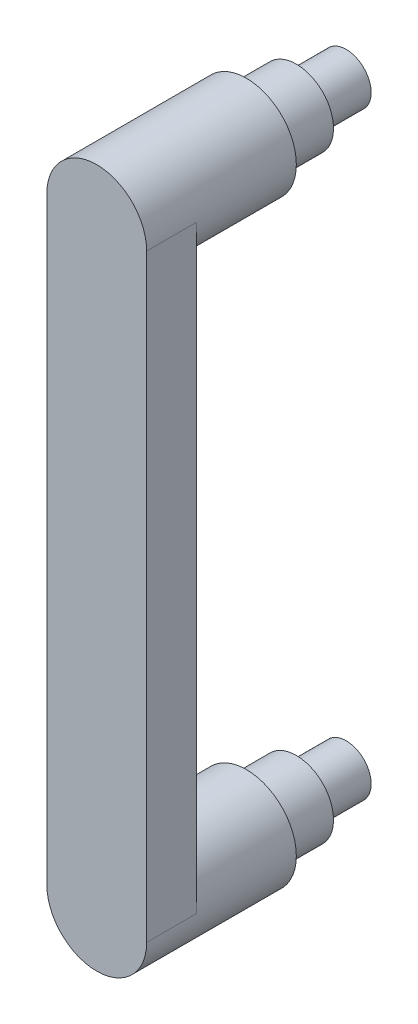
ISO-10303-21;
HEADER;
FILE_DESCRIPTION(('STEP AP214'),'2;1');
FILE_NAME('part.step','',(''),(''),'','','');
FILE_SCHEMA(('AUTOMOTIVE_DESIGN { 1 0 10303 214 1 1 1 1 }'));
ENDSEC;
DATA;
#1=APPLICATION_CONTEXT('core data for automotive mechanical design processes');
#2=APPLICATION_PROTOCOL_DEFINITION('international standard','automotive_design',2000,#1);
#3=PRODUCT_CONTEXT('',#1,'mechanical');
#4=PRODUCT('Part','Part','',(#3));
#5=PRODUCT_RELATED_PRODUCT_CATEGORY('part','',(#4));
#6=PRODUCT_DEFINITION_FORMATION('','',#4);
#7=PRODUCT_DEFINITION_CONTEXT('part definition',#1,'design');
#8=PRODUCT_DEFINITION('design','',#6,#7);
#9=PRODUCT_DEFINITION_SHAPE('','',#8);
#10=(LENGTH_UNIT() NAMED_UNIT(*) SI_UNIT(.MILLI.,.METRE.));
#11=(NAMED_UNIT(*) PLANE_ANGLE_UNIT() SI_UNIT($,.RADIAN.));
#12=(NAMED_UNIT(*) SI_UNIT($,.STERADIAN.) SOLID_ANGLE_UNIT());
#13=UNCERTAINTY_MEASURE_WITH_UNIT(LENGTH_MEASURE(1.E-05),#10,'distance_accuracy_value','');
#14=(GEOMETRIC_REPRESENTATION_CONTEXT(3) GLOBAL_UNCERTAINTY_ASSIGNED_CONTEXT((#13)) GLOBAL_UNIT_ASSIGNED_CONTEXT((#10,
#11,#12)) REPRESENTATION_CONTEXT('',''));
#15=CARTESIAN_POINT('',(0.,0.,0.));
#16=DIRECTION('',(0.,0.,1.));
#17=DIRECTION('',(1.,0.,0.));
#18=AXIS2_PLACEMENT_3D('',#15,#16,#17);
#19=CARTESIAN_POINT('',(0.,0.,4.));
#20=DIRECTION('',(0.,0.,-1.));
#21=DIRECTION('',(-1.,0.,0.));
#22=AXIS2_PLACEMENT_3D('',#19,#20,#21);
#23=CYLINDRICAL_SURFACE('',#22,1.49);
#24=CARTESIAN_POINT('',(0.,0.,4.));
#25=DIRECTION('',(0.,0.,1.));
#26=DIRECTION('',(1.,0.,0.));
#27=AXIS2_PLACEMENT_3D('',#24,#25,#26);
#28=CIRCLE('',#27,1.49);
#29=CARTESIAN_POINT('',(1.49,0.,4.));
#30=VERTEX_POINT('',#29);
#31=EDGE_CURVE('E152',#30,#30,#28,.T.);
#32=ORIENTED_EDGE('',*,*,#31,.F.);
#33=EDGE_LOOP('',(#32));
#34=FACE_BOUND('',#33,.T.);
#35=CARTESIAN_POINT('',(0.,0.,2.));
#36=DIRECTION('',(0.,0.,-1.));
#37=DIRECTION('',(-1.,0.,0.));
#38=AXIS2_PLACEMENT_3D('',#35,#36,#37);
#39=CIRCLE('',#38,1.49);
#40=CARTESIAN_POINT('',(-1.49,0.,2.));
#41=VERTEX_POINT('',#40);
#42=EDGE_CURVE('E116',#41,#41,#39,.T.);
#43=ORIENTED_EDGE('',*,*,#42,.F.);
#44=EDGE_LOOP('',(#43));
#45=FACE_BOUND('',#44,.T.);
#46=ADVANCED_FACE('F45',(#34,#45),#23,.T.);
#47=CARTESIAN_POINT('',(0.,24.,4.));
#48=DIRECTION('',(0.,0.,-1.));
#49=DIRECTION('',(-1.,0.,0.));
#50=AXIS2_PLACEMENT_3D('',#47,#48,#49);
#51=CYLINDRICAL_SURFACE('',#50,1.49);
#52=CARTESIAN_POINT('',(0.,24.,4.));
#53=DIRECTION('',(0.,0.,-1.));
#54=DIRECTION('',(1.,0.,0.));
#55=AXIS2_PLACEMENT_3D('',#52,#53,#54);
#56=CIRCLE('',#55,1.49);
#57=CARTESIAN_POINT('',(1.49,24.,4.));
#58=VERTEX_POINT('',#57);
#59=EDGE_CURVE('E127',#58,#58,#56,.T.);
#60=ORIENTED_EDGE('',*,*,#59,.T.);
#61=EDGE_LOOP('',(#60));
#62=FACE_BOUND('',#61,.T.);
#63=CARTESIAN_POINT('',(0.,24.,2.));
#64=DIRECTION('',(0.,0.,-1.));
#65=DIRECTION('',(-1.,0.,0.));
#66=AXIS2_PLACEMENT_3D('',#63,#64,#65);
#67=CIRCLE('',#66,1.49);
#68=CARTESIAN_POINT('',(-1.49,24.,2.));
#69=VERTEX_POINT('',#68);
#70=EDGE_CURVE('E48',#69,#69,#67,.T.);
#71=ORIENTED_EDGE('',*,*,#70,.F.);
#72=EDGE_LOOP('',(#71));
#73=FACE_BOUND('',#72,.T.);
#74=ADVANCED_FACE('F182',(#62,#73),#51,.T.);
#75=CARTESIAN_POINT('',(0.,0.,8.));
#76=DIRECTION('',(0.,0.,-1.));
#77=DIRECTION('',(-1.,0.,0.));
#78=AXIS2_PLACEMENT_3D('',#75,#76,#77);
#79=CYLINDRICAL_SURFACE('',#78,2.);
#80=CARTESIAN_POINT('',(0.,0.,8.));
#81=DIRECTION('',(0.,0.,1.));
#82=DIRECTION('',(1.,0.,0.));
#83=AXIS2_PLACEMENT_3D('',#80,#81,#82);
#84=CIRCLE('',#83,2.);
#85=CARTESIAN_POINT('',(2.,0.,8.));
#86=VERTEX_POINT('',#85);
#87=CARTESIAN_POINT('',(-2.,0.,8.));
#88=VERTEX_POINT('',#87);
#89=EDGE_CURVE('E62',#86,#88,#84,.T.);
#90=ORIENTED_EDGE('',*,*,#89,.F.);
#91=DIRECTION('',(0.,0.,-1.));
#92=VECTOR('',#91,1.);
#93=CARTESIAN_POINT('',(2.,0.,8.));
#94=LINE('',#93,#92);
#95=CARTESIAN_POINT('',(2.,0.,10.));
#96=VERTEX_POINT('',#95);
#97=EDGE_CURVE('E70',#96,#86,#94,.T.);
#98=ORIENTED_EDGE('',*,*,#97,.F.);
#99=CARTESIAN_POINT('',(0.,0.,10.));
#100=DIRECTION('',(0.,0.,1.));
#101=DIRECTION('',(1.,0.,0.));
#102=AXIS2_PLACEMENT_3D('',#99,#100,#101);
#103=CIRCLE('',#102,2.);
#104=CARTESIAN_POINT('',(-2.,0.,10.));
#105=VERTEX_POINT('',#104);
#106=EDGE_CURVE('E142',#96,#105,#103,.F.);
#107=ORIENTED_EDGE('',*,*,#106,.T.);
#108=DIRECTION('',(0.,0.,1.));
#109=VECTOR('',#108,1.);
#110=CARTESIAN_POINT('',(-2.,0.,8.));
#111=LINE('',#110,#109);
#112=EDGE_CURVE('E96',#88,#105,#111,.T.);
#113=ORIENTED_EDGE('',*,*,#112,.F.);
#114=EDGE_LOOP('',(#90,#98,#107,#113));
#115=FACE_BOUND('',#114,.T.);
#116=CARTESIAN_POINT('',(0.,0.,4.));
#117=DIRECTION('',(0.,0.,1.));
#118=DIRECTION('',(1.,0.,0.));
#119=AXIS2_PLACEMENT_3D('',#116,#117,#118);
#120=CIRCLE('',#119,2.);
#121=CARTESIAN_POINT('',(2.,0.,4.));
#122=VERTEX_POINT('',#121);
#123=EDGE_CURVE('E149',#122,#122,#120,.T.);
#124=ORIENTED_EDGE('',*,*,#123,.T.);
#125=EDGE_LOOP('',(#124));
#126=FACE_BOUND('',#125,.T.);
#127=ADVANCED_FACE('F184',(#115,#126),#79,.T.);
#128=CARTESIAN_POINT('',(0.,0.,4.));
#129=DIRECTION('',(0.,0.,1.));
#130=DIRECTION('',(1.,0.,0.));
#131=AXIS2_PLACEMENT_3D('',#128,#129,#130);
#132=PLANE('',#131);
#133=ORIENTED_EDGE('',*,*,#31,.T.);
#134=EDGE_LOOP('',(#133));
#135=FACE_BOUND('',#134,.T.);
#136=ORIENTED_EDGE('',*,*,#123,.F.);
#137=EDGE_LOOP('',(#136));
#138=FACE_BOUND('',#137,.T.);
#139=ADVANCED_FACE('F192',(#135,#138),#132,.F.);
#140=CARTESIAN_POINT('',(-2.,-2.001,10.));
#141=DIRECTION('',(0.,0.,1.));
#142=DIRECTION('',(1.,0.,0.));
#143=AXIS2_PLACEMENT_3D('',#140,#141,#142);
#144=PLANE('',#143);
#145=ORIENTED_EDGE('',*,*,#106,.F.);
#146=DIRECTION('',(0.,-1.,0.));
#147=VECTOR('',#146,1.);
#148=CARTESIAN_POINT('',(2.,12.,10.));
#149=LINE('',#148,#147);
#150=CARTESIAN_POINT('',(2.,24.,10.));
#151=VERTEX_POINT('',#150);
#152=EDGE_CURVE('E99',#151,#96,#149,.T.);
#153=ORIENTED_EDGE('',*,*,#152,.F.);
#154=CARTESIAN_POINT('',(0.,24.,10.));
#155=DIRECTION('',(0.,0.,-1.));
#156=DIRECTION('',(1.,0.,0.));
#157=AXIS2_PLACEMENT_3D('',#154,#155,#156);
#158=CIRCLE('',#157,2.);
#159=CARTESIAN_POINT('',(-2.,24.,10.));
#160=VERTEX_POINT('',#159);
#161=EDGE_CURVE('E102',#151,#160,#158,.F.);
#162=ORIENTED_EDGE('',*,*,#161,.T.);
#163=DIRECTION('',(0.,-1.,0.));
#164=VECTOR('',#163,1.);
#165=CARTESIAN_POINT('',(-2.,12.,10.));
#166=LINE('',#165,#164);
#167=EDGE_CURVE('E89',#160,#105,#166,.T.);
#168=ORIENTED_EDGE('',*,*,#167,.T.);
#169=EDGE_LOOP('',(#145,#153,#162,#168));
#170=FACE_BOUND('',#169,.T.);
#171=ADVANCED_FACE('F103',(#170),#144,.T.);
#172=CARTESIAN_POINT('',(-2.,-2.001,8.));
#173=DIRECTION('',(0.,0.,-1.));
#174=DIRECTION('',(-1.,0.,0.));
#175=AXIS2_PLACEMENT_3D('',#172,#173,#174);
#176=PLANE('',#175);
#177=DIRECTION('',(0.,-1.,0.));
#178=VECTOR('',#177,1.);
#179=CARTESIAN_POINT('',(2.,12.,8.));
#180=LINE('',#179,#178);
#181=CARTESIAN_POINT('',(2.,24.,8.));
#182=VERTEX_POINT('',#181);
#183=EDGE_CURVE('E137',#182,#86,#180,.T.);
#184=ORIENTED_EDGE('',*,*,#183,.T.);
#185=ORIENTED_EDGE('',*,*,#89,.T.);
#186=DIRECTION('',(0.,-1.,0.));
#187=VECTOR('',#186,1.);
#188=CARTESIAN_POINT('',(-2.,12.,8.));
#189=LINE('',#188,#187);
#190=CARTESIAN_POINT('',(-2.,24.,8.));
#191=VERTEX_POINT('',#190);
#192=EDGE_CURVE('E134',#191,#88,#189,.T.);
#193=ORIENTED_EDGE('',*,*,#192,.F.);
#194=CARTESIAN_POINT('',(0.,24.,8.));
#195=DIRECTION('',(0.,0.,-1.));
#196=DIRECTION('',(1.,0.,0.));
#197=AXIS2_PLACEMENT_3D('',#194,#195,#196);
#198=CIRCLE('',#197,2.);
#199=EDGE_CURVE('E114',#182,#191,#198,.T.);
#200=ORIENTED_EDGE('',*,*,#199,.F.);
#201=EDGE_LOOP('',(#184,#185,#193,#200));
#202=FACE_BOUND('',#201,.T.);
#203=ADVANCED_FACE('F203',(#202),#176,.T.);
#204=CARTESIAN_POINT('',(-2.,12.,8.));
#205=DIRECTION('',(1.,0.,0.));
#206=DIRECTION('',(0.,0.,-1.));
#207=AXIS2_PLACEMENT_3D('',#204,#205,#206);
#208=PLANE('',#207);
#209=ORIENTED_EDGE('',*,*,#112,.T.);
#210=ORIENTED_EDGE('',*,*,#167,.F.);
#211=DIRECTION('',(0.,0.,1.));
#212=VECTOR('',#211,1.);
#213=CARTESIAN_POINT('',(-2.,24.,8.));
#214=LINE('',#213,#212);
#215=EDGE_CURVE('E94',#191,#160,#214,.T.);
#216=ORIENTED_EDGE('',*,*,#215,.F.);
#217=ORIENTED_EDGE('',*,*,#192,.T.);
#218=EDGE_LOOP('',(#209,#210,#216,#217));
#219=FACE_BOUND('',#218,.T.);
#220=ADVANCED_FACE('F91',(#219),#208,.F.);
#221=CARTESIAN_POINT('',(2.,12.,8.));
#222=DIRECTION('',(-1.,0.,0.));
#223=DIRECTION('',(0.,0.,1.));
#224=AXIS2_PLACEMENT_3D('',#221,#222,#223);
#225=PLANE('',#224);
#226=ORIENTED_EDGE('',*,*,#97,.T.);
#227=ORIENTED_EDGE('',*,*,#183,.F.);
#228=DIRECTION('',(0.,0.,-1.));
#229=VECTOR('',#228,1.);
#230=CARTESIAN_POINT('',(2.,24.,8.));
#231=LINE('',#230,#229);
#232=EDGE_CURVE('E109',#151,#182,#231,.T.);
#233=ORIENTED_EDGE('',*,*,#232,.F.);
#234=ORIENTED_EDGE('',*,*,#152,.T.);
#235=EDGE_LOOP('',(#226,#227,#233,#234));
#236=FACE_BOUND('',#235,.T.);
#237=ADVANCED_FACE('F197',(#236),#225,.F.);
#238=CARTESIAN_POINT('',(0.,24.,8.));
#239=DIRECTION('',(0.,0.,-1.));
#240=DIRECTION('',(-1.,0.,0.));
#241=AXIS2_PLACEMENT_3D('',#238,#239,#240);
#242=CYLINDRICAL_SURFACE('',#241,2.);
#243=ORIENTED_EDGE('',*,*,#199,.T.);
#244=ORIENTED_EDGE('',*,*,#215,.T.);
#245=ORIENTED_EDGE('',*,*,#161,.F.);
#246=ORIENTED_EDGE('',*,*,#232,.T.);
#247=EDGE_LOOP('',(#243,#244,#245,#246));
#248=FACE_BOUND('',#247,.T.);
#249=CARTESIAN_POINT('',(0.,24.,4.));
#250=DIRECTION('',(0.,0.,-1.));
#251=DIRECTION('',(1.,0.,0.));
#252=AXIS2_PLACEMENT_3D('',#249,#250,#251);
#253=CIRCLE('',#252,2.);
#254=CARTESIAN_POINT('',(2.,24.,4.));
#255=VERTEX_POINT('',#254);
#256=EDGE_CURVE('E124',#255,#255,#253,.T.);
#257=ORIENTED_EDGE('',*,*,#256,.F.);
#258=EDGE_LOOP('',(#257));
#259=FACE_BOUND('',#258,.T.);
#260=ADVANCED_FACE('F111',(#248,#259),#242,.T.);
#261=CARTESIAN_POINT('',(0.,24.,4.));
#262=DIRECTION('',(0.,0.,1.));
#263=DIRECTION('',(1.,0.,0.));
#264=AXIS2_PLACEMENT_3D('',#261,#262,#263);
#265=PLANE('',#264);
#266=ORIENTED_EDGE('',*,*,#59,.F.);
#267=EDGE_LOOP('',(#266));
#268=FACE_BOUND('',#267,.T.);
#269=ORIENTED_EDGE('',*,*,#256,.T.);
#270=EDGE_LOOP('',(#269));
#271=FACE_BOUND('',#270,.T.);
#272=ADVANCED_FACE('F256',(#268,#271),#265,.F.);
#273=CARTESIAN_POINT('',(12.,26.,2.));
#274=DIRECTION('',(0.,0.,-1.));
#275=DIRECTION('',(-1.,0.,0.));
#276=AXIS2_PLACEMENT_3D('',#273,#274,#275);
#277=PLANE('',#276);
#278=CARTESIAN_POINT('',(0.,24.,2.));
#279=DIRECTION('',(0.,0.,-1.));
#280=DIRECTION('',(-1.,0.,0.));
#281=AXIS2_PLACEMENT_3D('',#278,#279,#280);
#282=CIRCLE('',#281,1.);
#283=CARTESIAN_POINT('',(-1.,24.,2.));
#284=VERTEX_POINT('',#283);
#285=EDGE_CURVE('E11',#284,#284,#282,.T.);
#286=ORIENTED_EDGE('',*,*,#285,.F.);
#287=EDGE_LOOP('',(#286));
#288=FACE_BOUND('',#287,.T.);
#289=ORIENTED_EDGE('',*,*,#70,.T.);
#290=EDGE_LOOP('',(#289));
#291=FACE_BOUND('',#290,.T.);
#292=ADVANCED_FACE('F180',(#288,#291),#277,.T.);
#293=CARTESIAN_POINT('',(0.,0.,2.));
#294=DIRECTION('',(0.,0.,-1.));
#295=DIRECTION('',(-1.,0.,0.));
#296=AXIS2_PLACEMENT_3D('',#293,#294,#295);
#297=CIRCLE('',#296,1.);
#298=CARTESIAN_POINT('',(-1.,0.,2.));
#299=VERTEX_POINT('',#298);
#300=EDGE_CURVE('E54',#299,#299,#297,.T.);
#301=ORIENTED_EDGE('',*,*,#300,.F.);
#302=EDGE_LOOP('',(#301));
#303=FACE_BOUND('',#302,.T.);
#304=ORIENTED_EDGE('',*,*,#42,.T.);
#305=EDGE_LOOP('',(#304));
#306=FACE_BOUND('',#305,.T.);
#307=ADVANCED_FACE('F279',(#303,#306),#277,.T.);
#308=CARTESIAN_POINT('',(0.,0.,0.));
#309=DIRECTION('',(0.,0.,1.));
#310=DIRECTION('',(1.,0.,0.));
#311=AXIS2_PLACEMENT_3D('',#308,#309,#310);
#312=CYLINDRICAL_SURFACE('',#311,1.);
#313=CARTESIAN_POINT('',(0.,0.,0.));
#314=DIRECTION('',(0.,0.,-1.));
#315=DIRECTION('',(-1.,0.,0.));
#316=AXIS2_PLACEMENT_3D('',#313,#314,#315);
#317=CIRCLE('',#316,1.);
#318=CARTESIAN_POINT('',(-1.,0.,0.));
#319=VERTEX_POINT('',#318);
#320=EDGE_CURVE('E166',#319,#319,#317,.T.);
#321=ORIENTED_EDGE('',*,*,#320,.F.);
#322=EDGE_LOOP('',(#321));
#323=FACE_BOUND('',#322,.T.);
#324=ORIENTED_EDGE('',*,*,#300,.T.);
#325=EDGE_LOOP('',(#324));
#326=FACE_BOUND('',#325,.T.);
#327=ADVANCED_FACE('F288',(#323,#326),#312,.T.);
#328=CARTESIAN_POINT('',(0.,0.,0.));
#329=DIRECTION('',(0.,0.,-1.));
#330=DIRECTION('',(-1.,0.,0.));
#331=AXIS2_PLACEMENT_3D('',#328,#329,#330);
#332=PLANE('',#331);
#333=ORIENTED_EDGE('',*,*,#320,.T.);
#334=EDGE_LOOP('',(#333));
#335=FACE_BOUND('',#334,.T.);
#336=ADVANCED_FACE('F296',(#335),#332,.T.);
#337=CARTESIAN_POINT('',(0.,24.,0.));
#338=DIRECTION('',(0.,0.,1.));
#339=DIRECTION('',(1.,0.,0.));
#340=AXIS2_PLACEMENT_3D('',#337,#338,#339);
#341=CYLINDRICAL_SURFACE('',#340,1.);
#342=CARTESIAN_POINT('',(0.,24.,0.));
#343=DIRECTION('',(0.,0.,-1.));
#344=DIRECTION('',(-1.,0.,0.));
#345=AXIS2_PLACEMENT_3D('',#342,#343,#344);
#346=CIRCLE('',#345,1.);
#347=CARTESIAN_POINT('',(-1.,24.,0.));
#348=VERTEX_POINT('',#347);
#349=EDGE_CURVE('E169',#348,#348,#346,.T.);
#350=ORIENTED_EDGE('',*,*,#349,.F.);
#351=EDGE_LOOP('',(#350));
#352=FACE_BOUND('',#351,.T.);
#353=ORIENTED_EDGE('',*,*,#285,.T.);
#354=EDGE_LOOP('',(#353));
#355=FACE_BOUND('',#354,.T.);
#356=ADVANCED_FACE('F305',(#352,#355),#341,.T.);
#357=CARTESIAN_POINT('',(0.,24.,0.));
#358=DIRECTION('',(0.,0.,-1.));
#359=DIRECTION('',(-1.,0.,0.));
#360=AXIS2_PLACEMENT_3D('',#357,#358,#359);
#361=PLANE('',#360);
#362=ORIENTED_EDGE('',*,*,#349,.T.);
#363=EDGE_LOOP('',(#362));
#364=FACE_BOUND('',#363,.T.);
#365=ADVANCED_FACE('F313',(#364),#361,.T.);
#366=CLOSED_SHELL('',(#46,#74,#127,#139,#171,#203,#220,#237,#260,#272,#292,#307,#327,#336,#356,#365));
#367=MANIFOLD_SOLID_BREP('B2',#366);
#368=ADVANCED_BREP_SHAPE_REPRESENTATION('',(#18,#367),#14);
#369=SHAPE_DEFINITION_REPRESENTATION(#9,#368);
ENDSEC;
END-ISO-10303-21;
